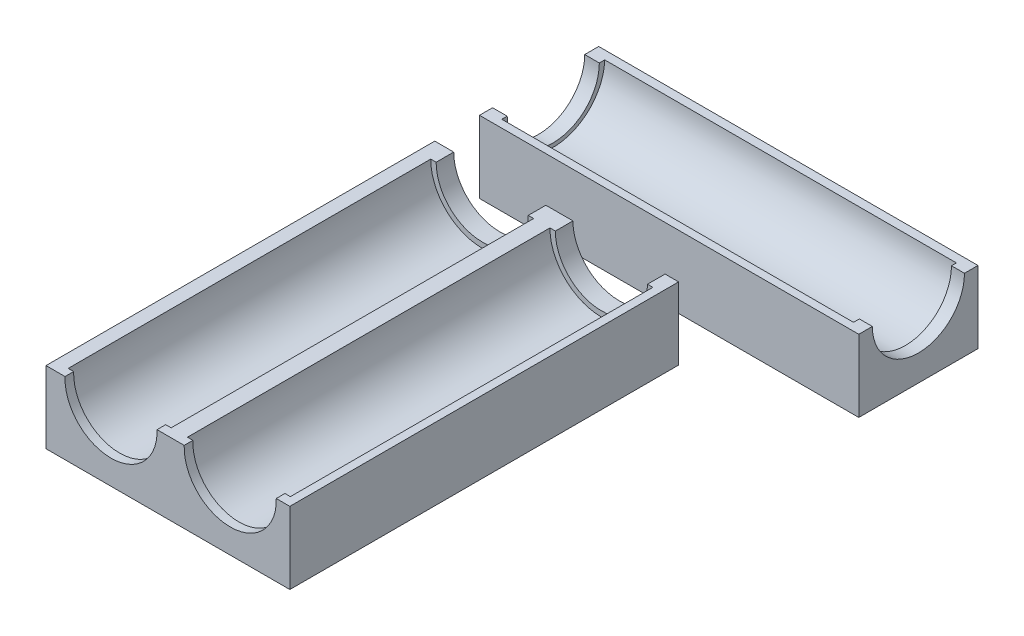
ISO-10303-21;
HEADER;
FILE_DESCRIPTION(('STEP AP214'),'2;1');
FILE_NAME('part.step','',(''),(''),'','','');
FILE_SCHEMA(('AUTOMOTIVE_DESIGN { 1 0 10303 214 1 1 1 1 }'));
ENDSEC;
DATA;
#1=APPLICATION_CONTEXT('core data for automotive mechanical design processes');
#2=APPLICATION_PROTOCOL_DEFINITION('international standard','automotive_design',2000,#1);
#3=PRODUCT_CONTEXT('',#1,'mechanical');
#4=PRODUCT('Part','Part','',(#3));
#5=PRODUCT_RELATED_PRODUCT_CATEGORY('part','',(#4));
#6=PRODUCT_DEFINITION_FORMATION('','',#4);
#7=PRODUCT_DEFINITION_CONTEXT('part definition',#1,'design');
#8=PRODUCT_DEFINITION('design','',#6,#7);
#9=PRODUCT_DEFINITION_SHAPE('','',#8);
#10=(LENGTH_UNIT() NAMED_UNIT(*) SI_UNIT(.MILLI.,.METRE.));
#11=(NAMED_UNIT(*) PLANE_ANGLE_UNIT() SI_UNIT($,.RADIAN.));
#12=(NAMED_UNIT(*) SI_UNIT($,.STERADIAN.) SOLID_ANGLE_UNIT());
#13=UNCERTAINTY_MEASURE_WITH_UNIT(LENGTH_MEASURE(1.E-05),#10,'distance_accuracy_value','');
#14=(GEOMETRIC_REPRESENTATION_CONTEXT(3) GLOBAL_UNCERTAINTY_ASSIGNED_CONTEXT((#13)) GLOBAL_UNIT_ASSIGNED_CONTEXT((#10,
#11,#12)) REPRESENTATION_CONTEXT('',''));
#15=CARTESIAN_POINT('',(0.,0.,0.));
#16=DIRECTION('',(0.,0.,1.));
#17=DIRECTION('',(1.,0.,0.));
#18=AXIS2_PLACEMENT_3D('',#15,#16,#17);
#19=CARTESIAN_POINT('',(0.,13.3,0.));
#20=DIRECTION('',(0.,-1.,0.));
#21=DIRECTION('',(0.,0.,-1.));
#22=AXIS2_PLACEMENT_3D('',#19,#20,#21);
#23=PLANE('',#22);
#24=DIRECTION('',(1.,0.,0.));
#25=VECTOR('',#24,1.);
#26=CARTESIAN_POINT('',(0.,13.3,-71.7461679585573));
#27=LINE('',#26,#25);
#28=CARTESIAN_POINT('',(42.5,13.3,-71.7461679585573));
#29=VERTEX_POINT('',#28);
#30=CARTESIAN_POINT('',(45.,13.3,-71.7461679585573));
#31=VERTEX_POINT('',#30);
#32=EDGE_CURVE('E276',#29,#31,#27,.T.);
#33=ORIENTED_EDGE('',*,*,#32,.F.);
#34=DIRECTION('',(0.,0.,1.));
#35=VECTOR('',#34,1.);
#36=CARTESIAN_POINT('',(42.5,13.3,-72.5));
#37=LINE('',#36,#35);
#38=CARTESIAN_POINT('',(42.5,13.3,-68.5));
#39=VERTEX_POINT('',#38);
#40=EDGE_CURVE('E68',#29,#39,#37,.T.);
#41=ORIENTED_EDGE('',*,*,#40,.T.);
#42=DIRECTION('',(-1.,0.,0.));
#43=VECTOR('',#42,1.);
#44=CARTESIAN_POINT('',(0.,13.3,-68.5));
#45=LINE('',#44,#43);
#46=CARTESIAN_POINT('',(43.5,13.3,-68.5));
#47=VERTEX_POINT('',#46);
#48=EDGE_CURVE('E206',#47,#39,#45,.T.);
#49=ORIENTED_EDGE('',*,*,#48,.F.);
#50=DIRECTION('',(0.,0.,1.));
#51=VECTOR('',#50,1.);
#52=CARTESIAN_POINT('',(43.5,13.3,-68.5));
#53=LINE('',#52,#51);
#54=CARTESIAN_POINT('',(43.5,13.3,-1.60000000000003));
#55=VERTEX_POINT('',#54);
#56=EDGE_CURVE('E201',#47,#55,#53,.T.);
#57=ORIENTED_EDGE('',*,*,#56,.T.);
#58=DIRECTION('',(-1.,0.,0.));
#59=VECTOR('',#58,1.);
#60=CARTESIAN_POINT('',(0.,13.3,-1.60000000000003));
#61=LINE('',#60,#59);
#62=CARTESIAN_POINT('',(42.4947042326381,13.3,-1.60000000000003));
#63=VERTEX_POINT('',#62);
#64=EDGE_CURVE('E204',#55,#63,#61,.T.);
#65=ORIENTED_EDGE('',*,*,#64,.T.);
#66=DIRECTION('',(0.,0.,1.));
#67=VECTOR('',#66,1.);
#68=CARTESIAN_POINT('',(42.4947042326381,13.3,-68.));
#69=LINE('',#68,#67);
#70=CARTESIAN_POINT('',(42.4947042326381,13.3,0.));
#71=VERTEX_POINT('',#70);
#72=EDGE_CURVE('E231',#63,#71,#69,.T.);
#73=ORIENTED_EDGE('',*,*,#72,.T.);
#74=DIRECTION('',(1.,0.,0.));
#75=VECTOR('',#74,1.);
#76=CARTESIAN_POINT('',(45.,13.3,0.));
#77=LINE('',#76,#75);
#78=CARTESIAN_POINT('',(45.,13.3,0.));
#79=VERTEX_POINT('',#78);
#80=EDGE_CURVE('E233',#71,#79,#77,.T.);
#81=ORIENTED_EDGE('',*,*,#80,.T.);
#82=DIRECTION('',(0.,0.,-1.));
#83=VECTOR('',#82,1.);
#84=CARTESIAN_POINT('',(45.,13.3,-80.));
#85=LINE('',#84,#83);
#86=EDGE_CURVE('E249',#79,#31,#85,.T.);
#87=ORIENTED_EDGE('',*,*,#86,.T.);
#88=EDGE_LOOP('',(#33,#41,#49,#57,#65,#73,#81,#87));
#89=FACE_BOUND('',#88,.T.);
#90=ADVANCED_FACE('F53',(#89),#23,.F.);
#91=CARTESIAN_POINT('',(25.5,13.3,-68.5));
#92=VERTEX_POINT('',#91);
#93=CARTESIAN_POINT('',(24.5,13.3,-68.5));
#94=VERTEX_POINT('',#93);
#95=EDGE_CURVE('E210',#92,#94,#45,.T.);
#96=ORIENTED_EDGE('',*,*,#95,.F.);
#97=DIRECTION('',(0.,0.,1.));
#98=VECTOR('',#97,1.);
#99=CARTESIAN_POINT('',(25.5,13.3,-72.5));
#100=LINE('',#99,#98);
#101=CARTESIAN_POINT('',(25.5,13.3,-71.7461679585573));
#102=VERTEX_POINT('',#101);
#103=EDGE_CURVE('E182',#92,#102,#100,.F.);
#104=ORIENTED_EDGE('',*,*,#103,.T.);
#105=CARTESIAN_POINT('',(20.5,13.3,-71.7461679585573));
#106=VERTEX_POINT('',#105);
#107=EDGE_CURVE('E181',#106,#102,#27,.T.);
#108=ORIENTED_EDGE('',*,*,#107,.F.);
#109=DIRECTION('',(0.,0.,1.));
#110=VECTOR('',#109,1.);
#111=CARTESIAN_POINT('',(20.5,13.3,-72.5));
#112=LINE('',#111,#110);
#113=CARTESIAN_POINT('',(20.5,13.3,-68.5));
#114=VERTEX_POINT('',#113);
#115=EDGE_CURVE('E75',#106,#114,#112,.T.);
#116=ORIENTED_EDGE('',*,*,#115,.T.);
#117=DIRECTION('',(-1.,0.,0.));
#118=VECTOR('',#117,1.);
#119=CARTESIAN_POINT('',(0.,13.3,-68.5));
#120=LINE('',#119,#118);
#121=CARTESIAN_POINT('',(21.5,13.3,-68.5));
#122=VERTEX_POINT('',#121);
#123=EDGE_CURVE('E178',#122,#114,#120,.T.);
#124=ORIENTED_EDGE('',*,*,#123,.F.);
#125=DIRECTION('',(0.,0.,1.));
#126=VECTOR('',#125,1.);
#127=CARTESIAN_POINT('',(21.5,13.3,-68.5));
#128=LINE('',#127,#126);
#129=CARTESIAN_POINT('',(21.5,13.3,-1.60000000000003));
#130=VERTEX_POINT('',#129);
#131=EDGE_CURVE('E195',#122,#130,#128,.T.);
#132=ORIENTED_EDGE('',*,*,#131,.T.);
#133=DIRECTION('',(-1.,0.,0.));
#134=VECTOR('',#133,1.);
#135=CARTESIAN_POINT('',(0.,13.3,-1.60000000000003));
#136=LINE('',#135,#134);
#137=CARTESIAN_POINT('',(20.4947042326381,13.3,-1.60000000000003));
#138=VERTEX_POINT('',#137);
#139=EDGE_CURVE('E226',#130,#138,#136,.T.);
#140=ORIENTED_EDGE('',*,*,#139,.T.);
#141=DIRECTION('',(0.,0.,1.));
#142=VECTOR('',#141,1.);
#143=CARTESIAN_POINT('',(20.4947042326381,13.3,-68.));
#144=LINE('',#143,#142);
#145=CARTESIAN_POINT('',(20.4947042326381,13.3,0.));
#146=VERTEX_POINT('',#145);
#147=EDGE_CURVE('E223',#138,#146,#144,.T.);
#148=ORIENTED_EDGE('',*,*,#147,.T.);
#149=CARTESIAN_POINT('',(25.5052957673619,13.3,0.));
#150=VERTEX_POINT('',#149);
#151=EDGE_CURVE('E225',#146,#150,#77,.T.);
#152=ORIENTED_EDGE('',*,*,#151,.T.);
#153=DIRECTION('',(0.,0.,1.));
#154=VECTOR('',#153,1.);
#155=CARTESIAN_POINT('',(25.5052957673619,13.3,-68.));
#156=LINE('',#155,#154);
#157=CARTESIAN_POINT('',(25.5052957673619,13.3,-1.60000000000003));
#158=VERTEX_POINT('',#157);
#159=EDGE_CURVE('E234',#150,#158,#156,.F.);
#160=ORIENTED_EDGE('',*,*,#159,.T.);
#161=CARTESIAN_POINT('',(24.5,13.3,-1.60000000000003));
#162=VERTEX_POINT('',#161);
#163=EDGE_CURVE('E213',#158,#162,#61,.T.);
#164=ORIENTED_EDGE('',*,*,#163,.T.);
#165=DIRECTION('',(0.,0.,1.));
#166=VECTOR('',#165,1.);
#167=CARTESIAN_POINT('',(24.5,13.3,-68.5));
#168=LINE('',#167,#166);
#169=EDGE_CURVE('E205',#162,#94,#168,.F.);
#170=ORIENTED_EDGE('',*,*,#169,.T.);
#171=EDGE_LOOP('',(#96,#104,#108,#116,#124,#132,#140,#148,#152,#160,#164,#170));
#172=FACE_BOUND('',#171,.T.);
#173=ADVANCED_FACE('F176',(#172),#23,.F.);
#174=CARTESIAN_POINT('',(0.,13.3,0.));
#175=DIRECTION('',(1.,0.,0.));
#176=DIRECTION('',(0.,0.,-1.));
#177=AXIS2_PLACEMENT_3D('',#174,#175,#176);
#178=PLANE('',#177);
#179=DIRECTION('',(0.,0.,1.));
#180=VECTOR('',#179,1.);
#181=CARTESIAN_POINT('',(0.,13.3,0.));
#182=LINE('',#181,#180);
#183=CARTESIAN_POINT('',(0.,13.3,-71.7461679585573));
#184=VERTEX_POINT('',#183);
#185=CARTESIAN_POINT('',(0.,13.3,0.));
#186=VERTEX_POINT('',#185);
#187=EDGE_CURVE('E252',#184,#186,#182,.T.);
#188=ORIENTED_EDGE('',*,*,#187,.F.);
#189=DIRECTION('',(0.,-1.,0.));
#190=VECTOR('',#189,1.);
#191=CARTESIAN_POINT('',(0.,0.,-71.7461679585573));
#192=LINE('',#191,#190);
#193=CARTESIAN_POINT('',(0.,0.,-71.7461679585573));
#194=VERTEX_POINT('',#193);
#195=EDGE_CURVE('E278',#184,#194,#192,.T.);
#196=ORIENTED_EDGE('',*,*,#195,.T.);
#197=DIRECTION('',(0.,0.,1.));
#198=VECTOR('',#197,1.);
#199=CARTESIAN_POINT('',(0.,0.,0.));
#200=LINE('',#199,#198);
#201=CARTESIAN_POINT('',(0.,0.,0.));
#202=VERTEX_POINT('',#201);
#203=EDGE_CURVE('E253',#194,#202,#200,.T.);
#204=ORIENTED_EDGE('',*,*,#203,.T.);
#205=DIRECTION('',(0.,-1.,0.));
#206=VECTOR('',#205,1.);
#207=CARTESIAN_POINT('',(0.,13.3,0.));
#208=LINE('',#207,#206);
#209=EDGE_CURVE('E240',#186,#202,#208,.T.);
#210=ORIENTED_EDGE('',*,*,#209,.F.);
#211=EDGE_LOOP('',(#188,#196,#204,#210));
#212=FACE_BOUND('',#211,.T.);
#213=ADVANCED_FACE('F55',(#212),#178,.F.);
#214=CARTESIAN_POINT('',(3.5,13.3,-68.5));
#215=VERTEX_POINT('',#214);
#216=CARTESIAN_POINT('',(2.5,13.3,-68.5));
#217=VERTEX_POINT('',#216);
#218=EDGE_CURVE('E188',#215,#217,#120,.T.);
#219=ORIENTED_EDGE('',*,*,#218,.F.);
#220=DIRECTION('',(0.,0.,1.));
#221=VECTOR('',#220,1.);
#222=CARTESIAN_POINT('',(3.5,13.3,-72.5));
#223=LINE('',#222,#221);
#224=CARTESIAN_POINT('',(3.5,13.3,-71.7461679585573));
#225=VERTEX_POINT('',#224);
#226=EDGE_CURVE('E166',#215,#225,#223,.F.);
#227=ORIENTED_EDGE('',*,*,#226,.T.);
#228=EDGE_CURVE('E273',#184,#225,#27,.T.);
#229=ORIENTED_EDGE('',*,*,#228,.F.);
#230=ORIENTED_EDGE('',*,*,#187,.T.);
#231=CARTESIAN_POINT('',(3.50529576736188,13.3,0.));
#232=VERTEX_POINT('',#231);
#233=EDGE_CURVE('E230',#186,#232,#77,.T.);
#234=ORIENTED_EDGE('',*,*,#233,.T.);
#235=DIRECTION('',(0.,0.,1.));
#236=VECTOR('',#235,1.);
#237=CARTESIAN_POINT('',(3.50529576736188,13.3,-68.));
#238=LINE('',#237,#236);
#239=CARTESIAN_POINT('',(3.50529576736188,13.3,-1.60000000000003));
#240=VERTEX_POINT('',#239);
#241=EDGE_CURVE('E227',#232,#240,#238,.F.);
#242=ORIENTED_EDGE('',*,*,#241,.T.);
#243=CARTESIAN_POINT('',(2.5,13.3,-1.60000000000003));
#244=VERTEX_POINT('',#243);
#245=EDGE_CURVE('E200',#240,#244,#136,.T.);
#246=ORIENTED_EDGE('',*,*,#245,.T.);
#247=DIRECTION('',(0.,0.,1.));
#248=VECTOR('',#247,1.);
#249=CARTESIAN_POINT('',(2.5,13.3,-68.5));
#250=LINE('',#249,#248);
#251=EDGE_CURVE('E197',#244,#217,#250,.F.);
#252=ORIENTED_EDGE('',*,*,#251,.T.);
#253=EDGE_LOOP('',(#219,#227,#229,#230,#234,#242,#246,#252));
#254=FACE_BOUND('',#253,.T.);
#255=ADVANCED_FACE('F286',(#254),#23,.F.);
#256=CARTESIAN_POINT('',(0.,0.,0.));
#257=DIRECTION('',(0.,-1.,0.));
#258=DIRECTION('',(0.,0.,-1.));
#259=AXIS2_PLACEMENT_3D('',#256,#257,#258);
#260=PLANE('',#259);
#261=DIRECTION('',(1.,0.,0.));
#262=VECTOR('',#261,1.);
#263=CARTESIAN_POINT('',(0.,0.,-71.7461679585573));
#264=LINE('',#263,#262);
#265=CARTESIAN_POINT('',(45.,0.,-71.7461679585573));
#266=VERTEX_POINT('',#265);
#267=EDGE_CURVE('E244',#194,#266,#264,.T.);
#268=ORIENTED_EDGE('',*,*,#267,.T.);
#269=DIRECTION('',(0.,0.,-1.));
#270=VECTOR('',#269,1.);
#271=CARTESIAN_POINT('',(45.,0.,-80.));
#272=LINE('',#271,#270);
#273=CARTESIAN_POINT('',(45.,0.,0.));
#274=VERTEX_POINT('',#273);
#275=EDGE_CURVE('E239',#274,#266,#272,.T.);
#276=ORIENTED_EDGE('',*,*,#275,.F.);
#277=DIRECTION('',(1.,0.,0.));
#278=VECTOR('',#277,1.);
#279=CARTESIAN_POINT('',(45.,0.,0.));
#280=LINE('',#279,#278);
#281=EDGE_CURVE('E243',#202,#274,#280,.T.);
#282=ORIENTED_EDGE('',*,*,#281,.F.);
#283=ORIENTED_EDGE('',*,*,#203,.F.);
#284=EDGE_LOOP('',(#268,#276,#282,#283));
#285=FACE_BOUND('',#284,.T.);
#286=ADVANCED_FACE('F323',(#285),#260,.T.);
#287=CARTESIAN_POINT('',(45.,13.3,0.));
#288=DIRECTION('',(0.,0.,-1.));
#289=DIRECTION('',(-1.,0.,0.));
#290=AXIS2_PLACEMENT_3D('',#287,#288,#289);
#291=PLANE('',#290);
#292=ORIENTED_EDGE('',*,*,#151,.F.);
#293=CARTESIAN_POINT('',(12.,13.,0.));
#294=DIRECTION('',(0.,0.,1.));
#295=DIRECTION('',(1.,0.,0.));
#296=AXIS2_PLACEMENT_3D('',#293,#294,#295);
#297=CIRCLE('',#296,8.5);
#298=EDGE_CURVE('E222',#232,#146,#297,.T.);
#299=ORIENTED_EDGE('',*,*,#298,.F.);
#300=ORIENTED_EDGE('',*,*,#233,.F.);
#301=ORIENTED_EDGE('',*,*,#209,.T.);
#302=ORIENTED_EDGE('',*,*,#281,.T.);
#303=DIRECTION('',(0.,-1.,0.));
#304=VECTOR('',#303,1.);
#305=CARTESIAN_POINT('',(45.,13.3,0.));
#306=LINE('',#305,#304);
#307=EDGE_CURVE('E218',#79,#274,#306,.T.);
#308=ORIENTED_EDGE('',*,*,#307,.F.);
#309=ORIENTED_EDGE('',*,*,#80,.F.);
#310=CARTESIAN_POINT('',(34.,13.,0.));
#311=DIRECTION('',(0.,0.,1.));
#312=DIRECTION('',(1.,0.,0.));
#313=AXIS2_PLACEMENT_3D('',#310,#311,#312);
#314=CIRCLE('',#313,8.5);
#315=EDGE_CURVE('E217',#150,#71,#314,.T.);
#316=ORIENTED_EDGE('',*,*,#315,.F.);
#317=EDGE_LOOP('',(#292,#299,#300,#301,#302,#308,#309,#316));
#318=FACE_BOUND('',#317,.T.);
#319=ADVANCED_FACE('F317',(#318),#291,.F.);
#320=CARTESIAN_POINT('',(45.,13.3,-80.));
#321=DIRECTION('',(-1.,0.,0.));
#322=DIRECTION('',(0.,0.,1.));
#323=AXIS2_PLACEMENT_3D('',#320,#321,#322);
#324=PLANE('',#323);
#325=ORIENTED_EDGE('',*,*,#275,.T.);
#326=DIRECTION('',(0.,-1.,0.));
#327=VECTOR('',#326,1.);
#328=CARTESIAN_POINT('',(45.,0.,-71.7461679585573));
#329=LINE('',#328,#327);
#330=EDGE_CURVE('E267',#31,#266,#329,.T.);
#331=ORIENTED_EDGE('',*,*,#330,.F.);
#332=ORIENTED_EDGE('',*,*,#86,.F.);
#333=ORIENTED_EDGE('',*,*,#307,.T.);
#334=EDGE_LOOP('',(#325,#331,#332,#333));
#335=FACE_BOUND('',#334,.T.);
#336=ADVANCED_FACE('F315',(#335),#324,.F.);
#337=CARTESIAN_POINT('',(34.,13.,-68.));
#338=DIRECTION('',(0.,0.,1.));
#339=DIRECTION('',(1.,0.,0.));
#340=AXIS2_PLACEMENT_3D('',#337,#338,#339);
#341=CYLINDRICAL_SURFACE('',#340,8.5);
#342=ORIENTED_EDGE('',*,*,#72,.F.);
#343=CARTESIAN_POINT('',(34.,13.,-1.60000000000003));
#344=DIRECTION('',(0.,0.,1.));
#345=DIRECTION('',(1.,0.,0.));
#346=AXIS2_PLACEMENT_3D('',#343,#344,#345);
#347=CIRCLE('',#346,8.5);
#348=EDGE_CURVE('E214',#63,#158,#347,.F.);
#349=ORIENTED_EDGE('',*,*,#348,.T.);
#350=ORIENTED_EDGE('',*,*,#159,.F.);
#351=ORIENTED_EDGE('',*,*,#315,.T.);
#352=EDGE_LOOP('',(#342,#349,#350,#351));
#353=FACE_BOUND('',#352,.T.);
#354=ADVANCED_FACE('F307',(#353),#341,.F.);
#355=CARTESIAN_POINT('',(12.,13.,-68.));
#356=DIRECTION('',(0.,0.,1.));
#357=DIRECTION('',(1.,0.,0.));
#358=AXIS2_PLACEMENT_3D('',#355,#356,#357);
#359=CYLINDRICAL_SURFACE('',#358,8.5);
#360=ORIENTED_EDGE('',*,*,#147,.F.);
#361=CARTESIAN_POINT('',(12.,13.,-1.60000000000003));
#362=DIRECTION('',(0.,0.,1.));
#363=DIRECTION('',(1.,0.,0.));
#364=AXIS2_PLACEMENT_3D('',#361,#362,#363);
#365=CIRCLE('',#364,8.5);
#366=EDGE_CURVE('E219',#138,#240,#365,.F.);
#367=ORIENTED_EDGE('',*,*,#366,.T.);
#368=ORIENTED_EDGE('',*,*,#241,.F.);
#369=ORIENTED_EDGE('',*,*,#298,.T.);
#370=EDGE_LOOP('',(#360,#367,#368,#369));
#371=FACE_BOUND('',#370,.T.);
#372=ADVANCED_FACE('F328',(#371),#359,.F.);
#373=CARTESIAN_POINT('',(12.,13.3,-68.5));
#374=DIRECTION('',(0.,0.,1.));
#375=DIRECTION('',(1.,0.,0.));
#376=AXIS2_PLACEMENT_3D('',#373,#374,#375);
#377=CYLINDRICAL_SURFACE('',#376,9.5);
#378=CARTESIAN_POINT('',(12.,13.3,-68.5));
#379=DIRECTION('',(0.,0.,1.));
#380=DIRECTION('',(1.,0.,0.));
#381=AXIS2_PLACEMENT_3D('',#378,#379,#380);
#382=CIRCLE('',#381,9.5);
#383=EDGE_CURVE('E187',#217,#122,#382,.T.);
#384=ORIENTED_EDGE('',*,*,#383,.F.);
#385=ORIENTED_EDGE('',*,*,#251,.F.);
#386=CARTESIAN_POINT('',(12.,13.3,-1.60000000000003));
#387=DIRECTION('',(0.,0.,1.));
#388=DIRECTION('',(1.,0.,0.));
#389=AXIS2_PLACEMENT_3D('',#386,#387,#388);
#390=CIRCLE('',#389,9.5);
#391=EDGE_CURVE('E192',#244,#130,#390,.T.);
#392=ORIENTED_EDGE('',*,*,#391,.T.);
#393=ORIENTED_EDGE('',*,*,#131,.F.);
#394=EDGE_LOOP('',(#384,#385,#392,#393));
#395=FACE_BOUND('',#394,.T.);
#396=ADVANCED_FACE('F334',(#395),#377,.F.);
#397=CARTESIAN_POINT('',(12.,13.3,-68.5));
#398=DIRECTION('',(0.,0.,1.));
#399=DIRECTION('',(1.,0.,0.));
#400=AXIS2_PLACEMENT_3D('',#397,#398,#399);
#401=PLANE('',#400);
#402=CARTESIAN_POINT('',(12.,13.3,-68.5));
#403=DIRECTION('',(0.,0.,1.));
#404=DIRECTION('',(1.,0.,0.));
#405=AXIS2_PLACEMENT_3D('',#402,#403,#404);
#406=CIRCLE('',#405,8.5);
#407=EDGE_CURVE('E163',#215,#114,#406,.T.);
#408=ORIENTED_EDGE('',*,*,#407,.F.);
#409=ORIENTED_EDGE('',*,*,#218,.T.);
#410=ORIENTED_EDGE('',*,*,#383,.T.);
#411=ORIENTED_EDGE('',*,*,#123,.T.);
#412=EDGE_LOOP('',(#408,#409,#410,#411));
#413=FACE_BOUND('',#412,.T.);
#414=ADVANCED_FACE('F185',(#413),#401,.T.);
#415=CARTESIAN_POINT('',(12.,13.3,-1.60000000000003));
#416=DIRECTION('',(0.,0.,1.));
#417=DIRECTION('',(1.,0.,0.));
#418=AXIS2_PLACEMENT_3D('',#415,#416,#417);
#419=PLANE('',#418);
#420=ORIENTED_EDGE('',*,*,#391,.F.);
#421=ORIENTED_EDGE('',*,*,#245,.F.);
#422=ORIENTED_EDGE('',*,*,#366,.F.);
#423=ORIENTED_EDGE('',*,*,#139,.F.);
#424=EDGE_LOOP('',(#420,#421,#422,#423));
#425=FACE_BOUND('',#424,.T.);
#426=ADVANCED_FACE('F332',(#425),#419,.F.);
#427=CARTESIAN_POINT('',(34.,13.3,-68.5));
#428=DIRECTION('',(0.,0.,1.));
#429=DIRECTION('',(1.,0.,0.));
#430=AXIS2_PLACEMENT_3D('',#427,#428,#429);
#431=CYLINDRICAL_SURFACE('',#430,9.5);
#432=CARTESIAN_POINT('',(34.,13.3,-68.5));
#433=DIRECTION('',(0.,0.,1.));
#434=DIRECTION('',(1.,0.,0.));
#435=AXIS2_PLACEMENT_3D('',#432,#433,#434);
#436=CIRCLE('',#435,9.5);
#437=EDGE_CURVE('E209',#94,#47,#436,.T.);
#438=ORIENTED_EDGE('',*,*,#437,.F.);
#439=ORIENTED_EDGE('',*,*,#169,.F.);
#440=CARTESIAN_POINT('',(34.,13.3,-1.60000000000003));
#441=DIRECTION('',(0.,0.,1.));
#442=DIRECTION('',(1.,0.,0.));
#443=AXIS2_PLACEMENT_3D('',#440,#441,#442);
#444=CIRCLE('',#443,9.5);
#445=EDGE_CURVE('E190',#162,#55,#444,.T.);
#446=ORIENTED_EDGE('',*,*,#445,.T.);
#447=ORIENTED_EDGE('',*,*,#56,.F.);
#448=EDGE_LOOP('',(#438,#439,#446,#447));
#449=FACE_BOUND('',#448,.T.);
#450=ADVANCED_FACE('F299',(#449),#431,.F.);
#451=CARTESIAN_POINT('',(34.,13.3,-68.5));
#452=DIRECTION('',(0.,0.,1.));
#453=DIRECTION('',(1.,0.,0.));
#454=AXIS2_PLACEMENT_3D('',#451,#452,#453);
#455=PLANE('',#454);
#456=CARTESIAN_POINT('',(34.,13.3,-68.5));
#457=DIRECTION('',(0.,0.,1.));
#458=DIRECTION('',(1.,0.,0.));
#459=AXIS2_PLACEMENT_3D('',#456,#457,#458);
#460=CIRCLE('',#459,8.5);
#461=EDGE_CURVE('E170',#92,#39,#460,.T.);
#462=ORIENTED_EDGE('',*,*,#461,.F.);
#463=ORIENTED_EDGE('',*,*,#95,.T.);
#464=ORIENTED_EDGE('',*,*,#437,.T.);
#465=ORIENTED_EDGE('',*,*,#48,.T.);
#466=EDGE_LOOP('',(#462,#463,#464,#465));
#467=FACE_BOUND('',#466,.T.);
#468=ADVANCED_FACE('F296',(#467),#455,.T.);
#469=CARTESIAN_POINT('',(34.,13.3,-1.60000000000003));
#470=DIRECTION('',(0.,0.,1.));
#471=DIRECTION('',(1.,0.,0.));
#472=AXIS2_PLACEMENT_3D('',#469,#470,#471);
#473=PLANE('',#472);
#474=ORIENTED_EDGE('',*,*,#445,.F.);
#475=ORIENTED_EDGE('',*,*,#163,.F.);
#476=ORIENTED_EDGE('',*,*,#348,.F.);
#477=ORIENTED_EDGE('',*,*,#64,.F.);
#478=EDGE_LOOP('',(#474,#475,#476,#477));
#479=FACE_BOUND('',#478,.T.);
#480=ADVANCED_FACE('F303',(#479),#473,.F.);
#481=CARTESIAN_POINT('',(0.,0.,-71.7461679585573));
#482=DIRECTION('',(0.,0.,1.));
#483=DIRECTION('',(1.,0.,0.));
#484=AXIS2_PLACEMENT_3D('',#481,#482,#483);
#485=PLANE('',#484);
#486=ORIENTED_EDGE('',*,*,#107,.T.);
#487=CARTESIAN_POINT('',(34.,13.3,-71.7461679585573));
#488=DIRECTION('',(0.,0.,1.));
#489=DIRECTION('',(1.,0.,0.));
#490=AXIS2_PLACEMENT_3D('',#487,#488,#489);
#491=CIRCLE('',#490,8.5);
#492=EDGE_CURVE('E12',#102,#29,#491,.T.);
#493=ORIENTED_EDGE('',*,*,#492,.T.);
#494=ORIENTED_EDGE('',*,*,#32,.T.);
#495=ORIENTED_EDGE('',*,*,#330,.T.);
#496=ORIENTED_EDGE('',*,*,#267,.F.);
#497=ORIENTED_EDGE('',*,*,#195,.F.);
#498=ORIENTED_EDGE('',*,*,#228,.T.);
#499=CARTESIAN_POINT('',(12.,13.3,-71.7461679585573));
#500=DIRECTION('',(0.,0.,1.));
#501=DIRECTION('',(1.,0.,0.));
#502=AXIS2_PLACEMENT_3D('',#499,#500,#501);
#503=CIRCLE('',#502,8.5);
#504=EDGE_CURVE('E61',#225,#106,#503,.T.);
#505=ORIENTED_EDGE('',*,*,#504,.T.);
#506=EDGE_LOOP('',(#486,#493,#494,#495,#496,#497,#498,#505));
#507=FACE_BOUND('',#506,.T.);
#508=ADVANCED_FACE('F283',(#507),#485,.F.);
#509=CARTESIAN_POINT('',(12.,13.3,-72.5));
#510=DIRECTION('',(0.,0.,1.));
#511=DIRECTION('',(1.,0.,0.));
#512=AXIS2_PLACEMENT_3D('',#509,#510,#511);
#513=CYLINDRICAL_SURFACE('',#512,8.5);
#514=ORIENTED_EDGE('',*,*,#504,.F.);
#515=ORIENTED_EDGE('',*,*,#226,.F.);
#516=ORIENTED_EDGE('',*,*,#407,.T.);
#517=ORIENTED_EDGE('',*,*,#115,.F.);
#518=EDGE_LOOP('',(#514,#515,#516,#517));
#519=FACE_BOUND('',#518,.T.);
#520=ADVANCED_FACE('F164',(#519),#513,.F.);
#521=CARTESIAN_POINT('',(34.,13.3,-72.5));
#522=DIRECTION('',(0.,0.,1.));
#523=DIRECTION('',(1.,0.,0.));
#524=AXIS2_PLACEMENT_3D('',#521,#522,#523);
#525=CYLINDRICAL_SURFACE('',#524,8.5);
#526=ORIENTED_EDGE('',*,*,#492,.F.);
#527=ORIENTED_EDGE('',*,*,#103,.F.);
#528=ORIENTED_EDGE('',*,*,#461,.T.);
#529=ORIENTED_EDGE('',*,*,#40,.F.);
#530=EDGE_LOOP('',(#526,#527,#528,#529));
#531=FACE_BOUND('',#530,.T.);
#532=ADVANCED_FACE('F454',(#531),#525,.F.);
#533=CLOSED_SHELL('',(#90,#173,#213,#255,#286,#319,#336,#354,#372,#396,#414,#426,#450,#468,#480,
#508,#520,#532));
#534=MANIFOLD_SOLID_BREP('B2',#533);
#535=CARTESIAN_POINT('',(0.,13.3,0.));
#536=DIRECTION('',(0.,-1.,0.));
#537=DIRECTION('',(0.,0.,-1.));
#538=AXIS2_PLACEMENT_3D('',#535,#536,#537);
#539=PLANE('',#538);
#540=DIRECTION('',(0.,0.,1.));
#541=VECTOR('',#540,1.);
#542=CARTESIAN_POINT('',(0.,13.3,0.));
#543=LINE('',#542,#541);
#544=CARTESIAN_POINT('',(0.,13.3,-102.));
#545=VERTEX_POINT('',#544);
#546=CARTESIAN_POINT('',(0.,13.3,-99.4155212591712));
#547=VERTEX_POINT('',#546);
#548=EDGE_CURVE('E566',#545,#547,#543,.T.);
#549=ORIENTED_EDGE('',*,*,#548,.T.);
#550=DIRECTION('',(1.,0.,0.));
#551=VECTOR('',#550,1.);
#552=CARTESIAN_POINT('',(-61.4999999999999,13.3,-99.4155212591712));
#553=LINE('',#552,#551);
#554=CARTESIAN_POINT('',(2.70000000000004,13.3,-99.4155212591712));
#555=VERTEX_POINT('',#554);
#556=EDGE_CURVE('E555',#547,#555,#553,.T.);
#557=ORIENTED_EDGE('',*,*,#556,.T.);
#558=DIRECTION('',(0.,0.,1.));
#559=VECTOR('',#558,1.);
#560=CARTESIAN_POINT('',(2.70000000000004,13.3,0.));
#561=LINE('',#560,#559);
#562=CARTESIAN_POINT('',(2.70000000000004,13.3,-100.411654211038));
#563=VERTEX_POINT('',#562);
#564=EDGE_CURVE('E563',#563,#555,#561,.T.);
#565=ORIENTED_EDGE('',*,*,#564,.F.);
#566=DIRECTION('',(-1.,0.,0.));
#567=VECTOR('',#566,1.);
#568=CARTESIAN_POINT('',(67.6,13.3,-100.411654211038));
#569=LINE('',#568,#567);
#570=CARTESIAN_POINT('',(67.6,13.3,-100.411654211038));
#571=VERTEX_POINT('',#570);
#572=EDGE_CURVE('E487',#571,#563,#569,.T.);
#573=ORIENTED_EDGE('',*,*,#572,.F.);
#574=DIRECTION('',(0.,0.,1.));
#575=VECTOR('',#574,1.);
#576=CARTESIAN_POINT('',(67.6,13.3,0.));
#577=LINE('',#576,#575);
#578=CARTESIAN_POINT('',(67.6,13.3,-99.5032641977337));
#579=VERTEX_POINT('',#578);
#580=EDGE_CURVE('E594',#571,#579,#577,.T.);
#581=ORIENTED_EDGE('',*,*,#580,.T.);
#582=DIRECTION('',(1.,0.,0.));
#583=VECTOR('',#582,1.);
#584=CARTESIAN_POINT('',(2.70000000000004,13.3,-99.5032641977337));
#585=LINE('',#584,#583);
#586=CARTESIAN_POINT('',(70.,13.3,-99.5032641977337));
#587=VERTEX_POINT('',#586);
#588=EDGE_CURVE('E576',#579,#587,#585,.T.);
#589=ORIENTED_EDGE('',*,*,#588,.T.);
#590=DIRECTION('',(0.,0.,-1.));
#591=VECTOR('',#590,1.);
#592=CARTESIAN_POINT('',(70.,13.3,-102.));
#593=LINE('',#592,#591);
#594=CARTESIAN_POINT('',(70.,13.3,-102.));
#595=VERTEX_POINT('',#594);
#596=EDGE_CURVE('E611',#587,#595,#593,.T.);
#597=ORIENTED_EDGE('',*,*,#596,.T.);
#598=DIRECTION('',(-1.,0.,0.));
#599=VECTOR('',#598,1.);
#600=CARTESIAN_POINT('',(0.,13.3,-102.));
#601=LINE('',#600,#599);
#602=EDGE_CURVE('E619',#595,#545,#601,.T.);
#603=ORIENTED_EDGE('',*,*,#602,.T.);
#604=EDGE_LOOP('',(#549,#557,#565,#573,#581,#589,#597,#603));
#605=FACE_BOUND('',#604,.T.);
#606=ADVANCED_FACE('F479',(#605),#539,.F.);
#607=CARTESIAN_POINT('',(70.,13.3,-102.));
#608=DIRECTION('',(-1.,0.,0.));
#609=DIRECTION('',(0.,0.,1.));
#610=AXIS2_PLACEMENT_3D('',#607,#608,#609);
#611=PLANE('',#610);
#612=ORIENTED_EDGE('',*,*,#596,.F.);
#613=CARTESIAN_POINT('',(70.,13.3,-91.0032641977337));
#614=DIRECTION('',(1.,0.,0.));
#615=DIRECTION('',(0.,0.,-1.));
#616=AXIS2_PLACEMENT_3D('',#613,#614,#615);
#617=CIRCLE('',#616,8.50000000000001);
#618=CARTESIAN_POINT('',(70.,13.3,-82.5032641977337));
#619=VERTEX_POINT('',#618);
#620=EDGE_CURVE('E598',#619,#587,#617,.T.);
#621=ORIENTED_EDGE('',*,*,#620,.F.);
#622=CARTESIAN_POINT('',(70.,13.3,-80.));
#623=VERTEX_POINT('',#622);
#624=EDGE_CURVE('E616',#623,#619,#593,.T.);
#625=ORIENTED_EDGE('',*,*,#624,.F.);
#626=DIRECTION('',(0.,-1.,0.));
#627=VECTOR('',#626,1.);
#628=CARTESIAN_POINT('',(70.,13.3,-80.));
#629=LINE('',#628,#627);
#630=CARTESIAN_POINT('',(70.,0.,-80.));
#631=VERTEX_POINT('',#630);
#632=EDGE_CURVE('E578',#623,#631,#629,.T.);
#633=ORIENTED_EDGE('',*,*,#632,.T.);
#634=DIRECTION('',(0.,0.,-1.));
#635=VECTOR('',#634,1.);
#636=CARTESIAN_POINT('',(70.,0.,-102.));
#637=LINE('',#636,#635);
#638=CARTESIAN_POINT('',(70.,0.,-102.));
#639=VERTEX_POINT('',#638);
#640=EDGE_CURVE('E629',#631,#639,#637,.T.);
#641=ORIENTED_EDGE('',*,*,#640,.T.);
#642=DIRECTION('',(0.,-1.,0.));
#643=VECTOR('',#642,1.);
#644=CARTESIAN_POINT('',(70.,13.3,-102.));
#645=LINE('',#644,#643);
#646=EDGE_CURVE('E614',#595,#639,#645,.T.);
#647=ORIENTED_EDGE('',*,*,#646,.F.);
#648=EDGE_LOOP('',(#612,#621,#625,#633,#641,#647));
#649=FACE_BOUND('',#648,.T.);
#650=ADVANCED_FACE('F612',(#649),#611,.F.);
#651=CARTESIAN_POINT('',(0.,13.3,-102.));
#652=DIRECTION('',(0.,0.,1.));
#653=DIRECTION('',(1.,0.,0.));
#654=AXIS2_PLACEMENT_3D('',#651,#652,#653);
#655=PLANE('',#654);
#656=DIRECTION('',(-1.,0.,0.));
#657=VECTOR('',#656,1.);
#658=CARTESIAN_POINT('',(0.,0.,-102.));
#659=LINE('',#658,#657);
#660=CARTESIAN_POINT('',(0.,0.,-102.));
#661=VERTEX_POINT('',#660);
#662=EDGE_CURVE('E631',#639,#661,#659,.T.);
#663=ORIENTED_EDGE('',*,*,#662,.T.);
#664=DIRECTION('',(0.,-1.,0.));
#665=VECTOR('',#664,1.);
#666=CARTESIAN_POINT('',(0.,13.3,-102.));
#667=LINE('',#666,#665);
#668=EDGE_CURVE('E627',#545,#661,#667,.T.);
#669=ORIENTED_EDGE('',*,*,#668,.F.);
#670=ORIENTED_EDGE('',*,*,#602,.F.);
#671=ORIENTED_EDGE('',*,*,#646,.T.);
#672=EDGE_LOOP('',(#663,#669,#670,#671));
#673=FACE_BOUND('',#672,.T.);
#674=ADVANCED_FACE('F644',(#673),#655,.F.);
#675=CARTESIAN_POINT('',(2.70000000000004,13.3,-82.4155212591712));
#676=VERTEX_POINT('',#675);
#677=CARTESIAN_POINT('',(2.70000000000004,13.3,-81.419388307305));
#678=VERTEX_POINT('',#677);
#679=EDGE_CURVE('E573',#676,#678,#561,.T.);
#680=ORIENTED_EDGE('',*,*,#679,.F.);
#681=DIRECTION('',(1.,0.,0.));
#682=VECTOR('',#681,1.);
#683=CARTESIAN_POINT('',(-61.4999999999999,13.3,-82.4155212591712));
#684=LINE('',#683,#682);
#685=CARTESIAN_POINT('',(0.,13.3,-82.4155212591712));
#686=VERTEX_POINT('',#685);
#687=EDGE_CURVE('E493',#676,#686,#684,.F.);
#688=ORIENTED_EDGE('',*,*,#687,.T.);
#689=CARTESIAN_POINT('',(0.,13.3,-80.));
#690=VERTEX_POINT('',#689);
#691=EDGE_CURVE('E625',#686,#690,#543,.T.);
#692=ORIENTED_EDGE('',*,*,#691,.T.);
#693=DIRECTION('',(1.,0.,0.));
#694=VECTOR('',#693,1.);
#695=CARTESIAN_POINT('',(70.,13.3,-80.));
#696=LINE('',#695,#694);
#697=EDGE_CURVE('E617',#690,#623,#696,.T.);
#698=ORIENTED_EDGE('',*,*,#697,.T.);
#699=ORIENTED_EDGE('',*,*,#624,.T.);
#700=DIRECTION('',(1.,0.,0.));
#701=VECTOR('',#700,1.);
#702=CARTESIAN_POINT('',(2.70000000000004,13.3,-82.5032641977337));
#703=LINE('',#702,#701);
#704=CARTESIAN_POINT('',(67.6,13.3,-82.5032641977337));
#705=VERTEX_POINT('',#704);
#706=EDGE_CURVE('E572',#619,#705,#703,.F.);
#707=ORIENTED_EDGE('',*,*,#706,.T.);
#708=CARTESIAN_POINT('',(67.6,13.3,-81.419388307305));
#709=VERTEX_POINT('',#708);
#710=EDGE_CURVE('E599',#705,#709,#577,.T.);
#711=ORIENTED_EDGE('',*,*,#710,.T.);
#712=DIRECTION('',(-1.,0.,0.));
#713=VECTOR('',#712,1.);
#714=CARTESIAN_POINT('',(67.6,13.3,-81.419388307305));
#715=LINE('',#714,#713);
#716=EDGE_CURVE('E586',#678,#709,#715,.F.);
#717=ORIENTED_EDGE('',*,*,#716,.F.);
#718=EDGE_LOOP('',(#680,#688,#692,#698,#699,#707,#711,#717));
#719=FACE_BOUND('',#718,.T.);
#720=ADVANCED_FACE('F656',(#719),#539,.F.);
#721=CARTESIAN_POINT('',(0.,0.,0.));
#722=DIRECTION('',(0.,-1.,0.));
#723=DIRECTION('',(0.,0.,-1.));
#724=AXIS2_PLACEMENT_3D('',#721,#722,#723);
#725=PLANE('',#724);
#726=DIRECTION('',(1.,0.,0.));
#727=VECTOR('',#726,1.);
#728=CARTESIAN_POINT('',(70.,0.,-80.));
#729=LINE('',#728,#727);
#730=CARTESIAN_POINT('',(0.,0.,-80.));
#731=VERTEX_POINT('',#730);
#732=EDGE_CURVE('E501',#731,#631,#729,.T.);
#733=ORIENTED_EDGE('',*,*,#732,.F.);
#734=DIRECTION('',(0.,0.,1.));
#735=VECTOR('',#734,1.);
#736=CARTESIAN_POINT('',(0.,0.,0.));
#737=LINE('',#736,#735);
#738=EDGE_CURVE('E620',#661,#731,#737,.T.);
#739=ORIENTED_EDGE('',*,*,#738,.F.);
#740=ORIENTED_EDGE('',*,*,#662,.F.);
#741=ORIENTED_EDGE('',*,*,#640,.F.);
#742=EDGE_LOOP('',(#733,#739,#740,#741));
#743=FACE_BOUND('',#742,.T.);
#744=ADVANCED_FACE('F642',(#743),#725,.T.);
#745=CARTESIAN_POINT('',(0.,13.3,0.));
#746=DIRECTION('',(1.,0.,0.));
#747=DIRECTION('',(0.,0.,-1.));
#748=AXIS2_PLACEMENT_3D('',#745,#746,#747);
#749=PLANE('',#748);
#750=ORIENTED_EDGE('',*,*,#691,.F.);
#751=CARTESIAN_POINT('',(0.,13.3,-90.9155212591712));
#752=DIRECTION('',(1.,0.,0.));
#753=DIRECTION('',(0.,0.,-1.));
#754=AXIS2_PLACEMENT_3D('',#751,#752,#753);
#755=CIRCLE('',#754,8.50000000000001);
#756=EDGE_CURVE('E649',#686,#547,#755,.T.);
#757=ORIENTED_EDGE('',*,*,#756,.T.);
#758=ORIENTED_EDGE('',*,*,#548,.F.);
#759=ORIENTED_EDGE('',*,*,#668,.T.);
#760=ORIENTED_EDGE('',*,*,#738,.T.);
#761=DIRECTION('',(0.,1.,0.));
#762=VECTOR('',#761,1.);
#763=CARTESIAN_POINT('',(0.,13.3,-80.));
#764=LINE('',#763,#762);
#765=EDGE_CURVE('E608',#731,#690,#764,.T.);
#766=ORIENTED_EDGE('',*,*,#765,.T.);
#767=EDGE_LOOP('',(#750,#757,#758,#759,#760,#766));
#768=FACE_BOUND('',#767,.T.);
#769=ADVANCED_FACE('F647',(#768),#749,.F.);
#770=CARTESIAN_POINT('',(70.,13.3,-80.));
#771=DIRECTION('',(0.,0.,-1.));
#772=DIRECTION('',(-1.,0.,0.));
#773=AXIS2_PLACEMENT_3D('',#770,#771,#772);
#774=PLANE('',#773);
#775=ORIENTED_EDGE('',*,*,#732,.T.);
#776=ORIENTED_EDGE('',*,*,#632,.F.);
#777=ORIENTED_EDGE('',*,*,#697,.F.);
#778=ORIENTED_EDGE('',*,*,#765,.F.);
#779=EDGE_LOOP('',(#775,#776,#777,#778));
#780=FACE_BOUND('',#779,.T.);
#781=ADVANCED_FACE('F481',(#780),#774,.F.);
#782=CARTESIAN_POINT('',(2.70000000000004,13.3,-91.0032641977337));
#783=DIRECTION('',(1.,0.,0.));
#784=DIRECTION('',(0.,0.,-1.));
#785=AXIS2_PLACEMENT_3D('',#782,#783,#784);
#786=CYLINDRICAL_SURFACE('',#785,8.50000000000001);
#787=ORIENTED_EDGE('',*,*,#588,.F.);
#788=CARTESIAN_POINT('',(67.6,13.3,-91.0032641977337));
#789=DIRECTION('',(1.,0.,0.));
#790=DIRECTION('',(0.,0.,-1.));
#791=AXIS2_PLACEMENT_3D('',#788,#789,#790);
#792=CIRCLE('',#791,8.50000000000001);
#793=EDGE_CURVE('E583',#579,#705,#792,.F.);
#794=ORIENTED_EDGE('',*,*,#793,.T.);
#795=ORIENTED_EDGE('',*,*,#706,.F.);
#796=ORIENTED_EDGE('',*,*,#620,.T.);
#797=EDGE_LOOP('',(#787,#794,#795,#796));
#798=FACE_BOUND('',#797,.T.);
#799=ADVANCED_FACE('F602',(#798),#786,.F.);
#800=CARTESIAN_POINT('',(2.70000000000004,13.3,-91.0032641977337));
#801=DIRECTION('',(1.,0.,0.));
#802=DIRECTION('',(0.,0.,-1.));
#803=AXIS2_PLACEMENT_3D('',#800,#801,#802);
#804=PLANE('',#803);
#805=CARTESIAN_POINT('',(2.70000000000004,13.3,-90.9155212591712));
#806=DIRECTION('',(1.,0.,0.));
#807=DIRECTION('',(0.,0.,-1.));
#808=AXIS2_PLACEMENT_3D('',#805,#806,#807);
#809=CIRCLE('',#808,8.50000000000001);
#810=EDGE_CURVE('E51',#676,#555,#809,.T.);
#811=ORIENTED_EDGE('',*,*,#810,.F.);
#812=ORIENTED_EDGE('',*,*,#679,.T.);
#813=CARTESIAN_POINT('',(2.70000000000004,13.571033135391,-90.9155212591712));
#814=DIRECTION('',(1.,0.,0.));
#815=DIRECTION('',(0.,0.,-1.));
#816=AXIS2_PLACEMENT_3D('',#813,#814,#815);
#817=CIRCLE('',#816,9.5);
#818=EDGE_CURVE('E567',#678,#563,#817,.T.);
#819=ORIENTED_EDGE('',*,*,#818,.T.);
#820=ORIENTED_EDGE('',*,*,#564,.T.);
#821=EDGE_LOOP('',(#811,#812,#819,#820));
#822=FACE_BOUND('',#821,.T.);
#823=ADVANCED_FACE('F570',(#822),#804,.T.);
#824=CARTESIAN_POINT('',(67.6,13.571033135391,-90.9155212591712));
#825=DIRECTION('',(-1.,0.,0.));
#826=DIRECTION('',(0.,0.,1.));
#827=AXIS2_PLACEMENT_3D('',#824,#825,#826);
#828=CYLINDRICAL_SURFACE('',#827,9.5);
#829=ORIENTED_EDGE('',*,*,#716,.T.);
#830=CARTESIAN_POINT('',(67.6,13.571033135391,-90.9155212591712));
#831=DIRECTION('',(1.,0.,0.));
#832=DIRECTION('',(0.,0.,-1.));
#833=AXIS2_PLACEMENT_3D('',#830,#831,#832);
#834=CIRCLE('',#833,9.5);
#835=EDGE_CURVE('E592',#709,#571,#834,.T.);
#836=ORIENTED_EDGE('',*,*,#835,.T.);
#837=ORIENTED_EDGE('',*,*,#572,.T.);
#838=ORIENTED_EDGE('',*,*,#818,.F.);
#839=EDGE_LOOP('',(#829,#836,#837,#838));
#840=FACE_BOUND('',#839,.T.);
#841=ADVANCED_FACE('F589',(#840),#828,.F.);
#842=CARTESIAN_POINT('',(67.6,13.571033135391,-90.9155212591712));
#843=DIRECTION('',(1.,0.,0.));
#844=DIRECTION('',(0.,0.,-1.));
#845=AXIS2_PLACEMENT_3D('',#842,#843,#844);
#846=PLANE('',#845);
#847=ORIENTED_EDGE('',*,*,#835,.F.);
#848=ORIENTED_EDGE('',*,*,#710,.F.);
#849=ORIENTED_EDGE('',*,*,#793,.F.);
#850=ORIENTED_EDGE('',*,*,#580,.F.);
#851=EDGE_LOOP('',(#847,#848,#849,#850));
#852=FACE_BOUND('',#851,.T.);
#853=ADVANCED_FACE('F657',(#852),#846,.F.);
#854=CARTESIAN_POINT('',(-61.4999999999999,13.3,-90.9155212591712));
#855=DIRECTION('',(1.,0.,0.));
#856=DIRECTION('',(0.,0.,-1.));
#857=AXIS2_PLACEMENT_3D('',#854,#855,#856);
#858=CYLINDRICAL_SURFACE('',#857,8.50000000000001);
#859=ORIENTED_EDGE('',*,*,#756,.F.);
#860=ORIENTED_EDGE('',*,*,#687,.F.);
#861=ORIENTED_EDGE('',*,*,#810,.T.);
#862=ORIENTED_EDGE('',*,*,#556,.F.);
#863=EDGE_LOOP('',(#859,#860,#861,#862));
#864=FACE_BOUND('',#863,.T.);
#865=ADVANCED_FACE('F554',(#864),#858,.F.);
#866=CLOSED_SHELL('',(#606,#650,#674,#720,#744,#769,#781,#799,#823,#841,#853,#865));
#867=MANIFOLD_SOLID_BREP('B6',#866);
#868=ADVANCED_BREP_SHAPE_REPRESENTATION('',(#18,#534,#867),#14);
#869=SHAPE_DEFINITION_REPRESENTATION(#9,#868);
ENDSEC;
END-ISO-10303-21;
